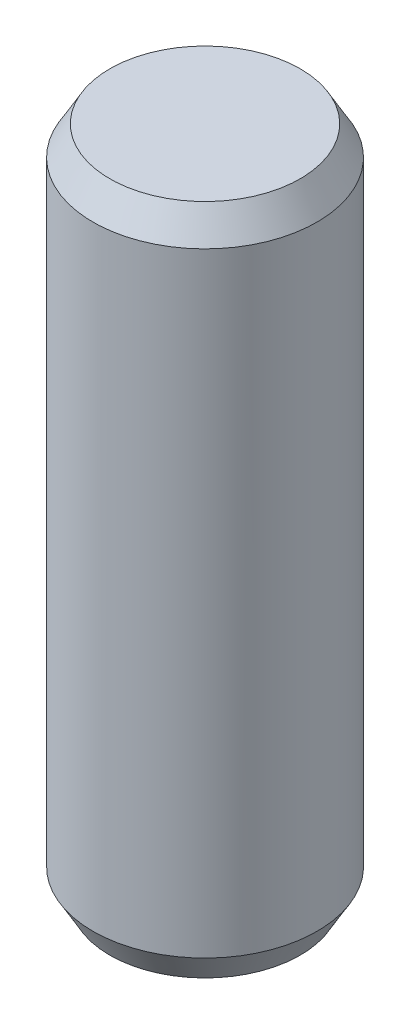
ISO-10303-21;
HEADER;
FILE_DESCRIPTION(('STEP AP214'),'2;1');
FILE_NAME('part.step','',(''),(''),'','','');
FILE_SCHEMA(('AUTOMOTIVE_DESIGN { 1 0 10303 214 1 1 1 1 }'));
ENDSEC;
DATA;
#1=APPLICATION_CONTEXT('core data for automotive mechanical design processes');
#2=APPLICATION_PROTOCOL_DEFINITION('international standard','automotive_design',2000,#1);
#3=PRODUCT_CONTEXT('',#1,'mechanical');
#4=PRODUCT('Part','Part','',(#3));
#5=PRODUCT_RELATED_PRODUCT_CATEGORY('part','',(#4));
#6=PRODUCT_DEFINITION_FORMATION('','',#4);
#7=PRODUCT_DEFINITION_CONTEXT('part definition',#1,'design');
#8=PRODUCT_DEFINITION('design','',#6,#7);
#9=PRODUCT_DEFINITION_SHAPE('','',#8);
#10=(LENGTH_UNIT() NAMED_UNIT(*) SI_UNIT(.MILLI.,.METRE.));
#11=(NAMED_UNIT(*) PLANE_ANGLE_UNIT() SI_UNIT($,.RADIAN.));
#12=(NAMED_UNIT(*) SI_UNIT($,.STERADIAN.) SOLID_ANGLE_UNIT());
#13=UNCERTAINTY_MEASURE_WITH_UNIT(LENGTH_MEASURE(1.E-05),#10,'distance_accuracy_value','');
#14=(GEOMETRIC_REPRESENTATION_CONTEXT(3) GLOBAL_UNCERTAINTY_ASSIGNED_CONTEXT((#13)) GLOBAL_UNIT_ASSIGNED_CONTEXT((#10,
#11,#12)) REPRESENTATION_CONTEXT('',''));
#15=CARTESIAN_POINT('',(0.,0.,0.));
#16=DIRECTION('',(0.,0.,1.));
#17=DIRECTION('',(1.,0.,0.));
#18=AXIS2_PLACEMENT_3D('',#15,#16,#17);
#19=CARTESIAN_POINT('',(0.,0.,0.));
#20=DIRECTION('',(0.,1.,0.));
#21=DIRECTION('',(0.,0.,1.));
#22=AXIS2_PLACEMENT_3D('',#19,#20,#21);
#23=PLANE('',#22);
#24=CARTESIAN_POINT('',(0.,0.,0.));
#25=DIRECTION('',(0.,1.,0.));
#26=DIRECTION('',(0.,0.,1.));
#27=AXIS2_PLACEMENT_3D('',#24,#25,#26);
#28=CIRCLE('',#27,1.7);
#29=CARTESIAN_POINT('',(0.,0.,1.7));
#30=VERTEX_POINT('',#29);
#31=EDGE_CURVE('E30',#30,#30,#28,.F.);
#32=ORIENTED_EDGE('',*,*,#31,.T.);
#33=EDGE_LOOP('',(#32));
#34=FACE_BOUND('',#33,.T.);
#35=ADVANCED_FACE('F15',(#34),#23,.F.);
#36=CARTESIAN_POINT('',(0.,0.,0.));
#37=DIRECTION('',(0.,-1.,0.));
#38=DIRECTION('',(0.,0.,-1.));
#39=AXIS2_PLACEMENT_3D('',#36,#37,#38);
#40=CYLINDRICAL_SURFACE('',#39,2.);
#41=CARTESIAN_POINT('',(0.,0.519615242270663,0.));
#42=DIRECTION('',(0.,1.,0.));
#43=DIRECTION('',(0.,0.,1.));
#44=AXIS2_PLACEMENT_3D('',#41,#42,#43);
#45=CIRCLE('',#44,2.);
#46=CARTESIAN_POINT('',(0.,0.519615242270663,2.));
#47=VERTEX_POINT('',#46);
#48=EDGE_CURVE('E22',#47,#47,#45,.T.);
#49=ORIENTED_EDGE('',*,*,#48,.T.);
#50=EDGE_LOOP('',(#49));
#51=FACE_BOUND('',#50,.T.);
#52=CARTESIAN_POINT('',(0.,11.4803847577293,0.));
#53=DIRECTION('',(0.,-1.,0.));
#54=DIRECTION('',(0.,0.,-1.));
#55=AXIS2_PLACEMENT_3D('',#52,#53,#54);
#56=CIRCLE('',#55,2.);
#57=CARTESIAN_POINT('',(0.,11.4803847577293,-2.));
#58=VERTEX_POINT('',#57);
#59=EDGE_CURVE('E26',#58,#58,#56,.T.);
#60=ORIENTED_EDGE('',*,*,#59,.T.);
#61=EDGE_LOOP('',(#60));
#62=FACE_BOUND('',#61,.T.);
#63=ADVANCED_FACE('F48',(#51,#62),#40,.T.);
#64=CARTESIAN_POINT('',(-2.,12.,0.));
#65=DIRECTION('',(0.,-1.,0.));
#66=DIRECTION('',(0.,0.,-1.));
#67=AXIS2_PLACEMENT_3D('',#64,#65,#66);
#68=PLANE('',#67);
#69=CARTESIAN_POINT('',(0.,12.,0.));
#70=DIRECTION('',(0.,-1.,0.));
#71=DIRECTION('',(0.,0.,-1.));
#72=AXIS2_PLACEMENT_3D('',#69,#70,#71);
#73=CIRCLE('',#72,1.7);
#74=CARTESIAN_POINT('',(0.,12.,-1.7));
#75=VERTEX_POINT('',#74);
#76=EDGE_CURVE('E10',#75,#75,#73,.F.);
#77=ORIENTED_EDGE('',*,*,#76,.T.);
#78=EDGE_LOOP('',(#77));
#79=FACE_BOUND('',#78,.T.);
#80=ADVANCED_FACE('F39',(#79),#68,.F.);
#81=CARTESIAN_POINT('',(0.,0.,0.));
#82=DIRECTION('',(0.,1.,0.));
#83=DIRECTION('',(0.,0.,1.));
#84=AXIS2_PLACEMENT_3D('',#81,#82,#83);
#85=CONICAL_SURFACE('',#84,1.7,0.523598775598299);
#86=ORIENTED_EDGE('',*,*,#48,.F.);
#87=EDGE_LOOP('',(#86));
#88=FACE_BOUND('',#87,.T.);
#89=ORIENTED_EDGE('',*,*,#31,.F.);
#90=EDGE_LOOP('',(#89));
#91=FACE_BOUND('',#90,.T.);
#92=ADVANCED_FACE('F37',(#88,#91),#85,.T.);
#93=CARTESIAN_POINT('',(0.,11.4803847577293,0.));
#94=DIRECTION('',(0.,-1.,0.));
#95=DIRECTION('',(0.,0.,-1.));
#96=AXIS2_PLACEMENT_3D('',#93,#94,#95);
#97=CONICAL_SURFACE('',#96,2.,0.5235987755983);
#98=ORIENTED_EDGE('',*,*,#76,.F.);
#99=EDGE_LOOP('',(#98));
#100=FACE_BOUND('',#99,.T.);
#101=ORIENTED_EDGE('',*,*,#59,.F.);
#102=EDGE_LOOP('',(#101));
#103=FACE_BOUND('',#102,.T.);
#104=ADVANCED_FACE('F17',(#100,#103),#97,.T.);
#105=CLOSED_SHELL('',(#35,#63,#80,#92,#104));
#106=MANIFOLD_SOLID_BREP('B1',#105);
#107=ADVANCED_BREP_SHAPE_REPRESENTATION('',(#18,#106),#14);
#108=SHAPE_DEFINITION_REPRESENTATION(#9,#107);
ENDSEC;
END-ISO-10303-21;
